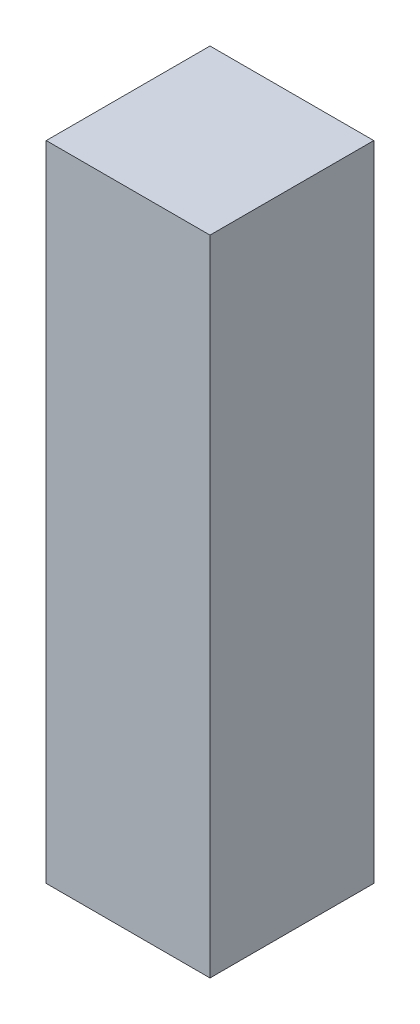
ISO-10303-21;
HEADER;
FILE_DESCRIPTION(('STEP AP214'),'2;1');
FILE_NAME('part.step','',(''),(''),'','','');
FILE_SCHEMA(('AUTOMOTIVE_DESIGN { 1 0 10303 214 1 1 1 1 }'));
ENDSEC;
DATA;
#1=APPLICATION_CONTEXT('core data for automotive mechanical design processes');
#2=APPLICATION_PROTOCOL_DEFINITION('international standard','automotive_design',2000,#1);
#3=PRODUCT_CONTEXT('',#1,'mechanical');
#4=PRODUCT('Part','Part','',(#3));
#5=PRODUCT_RELATED_PRODUCT_CATEGORY('part','',(#4));
#6=PRODUCT_DEFINITION_FORMATION('','',#4);
#7=PRODUCT_DEFINITION_CONTEXT('part definition',#1,'design');
#8=PRODUCT_DEFINITION('design','',#6,#7);
#9=PRODUCT_DEFINITION_SHAPE('','',#8);
#10=(LENGTH_UNIT() NAMED_UNIT(*) SI_UNIT(.MILLI.,.METRE.));
#11=(NAMED_UNIT(*) PLANE_ANGLE_UNIT() SI_UNIT($,.RADIAN.));
#12=(NAMED_UNIT(*) SI_UNIT($,.STERADIAN.) SOLID_ANGLE_UNIT());
#13=UNCERTAINTY_MEASURE_WITH_UNIT(LENGTH_MEASURE(1.E-05),#10,'distance_accuracy_value','');
#14=(GEOMETRIC_REPRESENTATION_CONTEXT(3) GLOBAL_UNCERTAINTY_ASSIGNED_CONTEXT((#13)) GLOBAL_UNIT_ASSIGNED_CONTEXT((#10,
#11,#12)) REPRESENTATION_CONTEXT('',''));
#15=CARTESIAN_POINT('',(0.,0.,0.));
#16=DIRECTION('',(0.,0.,1.));
#17=DIRECTION('',(1.,0.,0.));
#18=AXIS2_PLACEMENT_3D('',#15,#16,#17);
#19=CARTESIAN_POINT('',(3.5,13.75,3.5));
#20=DIRECTION('',(-1.,0.,0.));
#21=DIRECTION('',(0.,0.,1.));
#22=AXIS2_PLACEMENT_3D('',#19,#20,#21);
#23=PLANE('',#22);
#24=DIRECTION('',(0.,0.,-1.));
#25=VECTOR('',#24,1.);
#26=CARTESIAN_POINT('',(3.5,-13.75,3.5));
#27=LINE('',#26,#25);
#28=CARTESIAN_POINT('',(3.5,-13.75,3.5));
#29=VERTEX_POINT('',#28);
#30=CARTESIAN_POINT('',(3.5,-13.75,-3.5));
#31=VERTEX_POINT('',#30);
#32=EDGE_CURVE('E98',#29,#31,#27,.T.);
#33=ORIENTED_EDGE('',*,*,#32,.T.);
#34=DIRECTION('',(0.,-1.,0.));
#35=VECTOR('',#34,1.);
#36=CARTESIAN_POINT('',(3.5,13.75,-3.5));
#37=LINE('',#36,#35);
#38=CARTESIAN_POINT('',(3.5,13.75,-3.5));
#39=VERTEX_POINT('',#38);
#40=EDGE_CURVE('E11',#39,#31,#37,.T.);
#41=ORIENTED_EDGE('',*,*,#40,.F.);
#42=DIRECTION('',(0.,0.,-1.));
#43=VECTOR('',#42,1.);
#44=CARTESIAN_POINT('',(3.5,13.75,3.5));
#45=LINE('',#44,#43);
#46=CARTESIAN_POINT('',(3.5,13.75,3.5));
#47=VERTEX_POINT('',#46);
#48=EDGE_CURVE('E86',#47,#39,#45,.T.);
#49=ORIENTED_EDGE('',*,*,#48,.F.);
#50=DIRECTION('',(0.,-1.,0.));
#51=VECTOR('',#50,1.);
#52=CARTESIAN_POINT('',(3.5,13.75,3.5));
#53=LINE('',#52,#51);
#54=EDGE_CURVE('E94',#47,#29,#53,.T.);
#55=ORIENTED_EDGE('',*,*,#54,.T.);
#56=EDGE_LOOP('',(#33,#41,#49,#55));
#57=FACE_BOUND('',#56,.T.);
#58=ADVANCED_FACE('F35',(#57),#23,.F.);
#59=CARTESIAN_POINT('',(-3.5,13.75,-3.5));
#60=DIRECTION('',(0.,0.,1.));
#61=DIRECTION('',(1.,0.,0.));
#62=AXIS2_PLACEMENT_3D('',#59,#60,#61);
#63=PLANE('',#62);
#64=DIRECTION('',(-1.,0.,0.));
#65=VECTOR('',#64,1.);
#66=CARTESIAN_POINT('',(-3.5,-13.75,-3.5));
#67=LINE('',#66,#65);
#68=CARTESIAN_POINT('',(-3.5,-13.75,-3.5));
#69=VERTEX_POINT('',#68);
#70=EDGE_CURVE('E90',#31,#69,#67,.T.);
#71=ORIENTED_EDGE('',*,*,#70,.T.);
#72=DIRECTION('',(0.,-1.,0.));
#73=VECTOR('',#72,1.);
#74=CARTESIAN_POINT('',(-3.5,13.75,-3.5));
#75=LINE('',#74,#73);
#76=CARTESIAN_POINT('',(-3.5,13.75,-3.5));
#77=VERTEX_POINT('',#76);
#78=EDGE_CURVE('E43',#77,#69,#75,.T.);
#79=ORIENTED_EDGE('',*,*,#78,.F.);
#80=DIRECTION('',(-1.,0.,0.));
#81=VECTOR('',#80,1.);
#82=CARTESIAN_POINT('',(-3.5,13.75,-3.5));
#83=LINE('',#82,#81);
#84=EDGE_CURVE('E81',#39,#77,#83,.T.);
#85=ORIENTED_EDGE('',*,*,#84,.F.);
#86=ORIENTED_EDGE('',*,*,#40,.T.);
#87=EDGE_LOOP('',(#71,#79,#85,#86));
#88=FACE_BOUND('',#87,.T.);
#89=ADVANCED_FACE('F89',(#88),#63,.F.);
#90=CARTESIAN_POINT('',(-3.5,13.75,3.5));
#91=DIRECTION('',(1.,0.,0.));
#92=DIRECTION('',(0.,0.,-1.));
#93=AXIS2_PLACEMENT_3D('',#90,#91,#92);
#94=PLANE('',#93);
#95=DIRECTION('',(0.,0.,1.));
#96=VECTOR('',#95,1.);
#97=CARTESIAN_POINT('',(-3.5,-13.75,3.5));
#98=LINE('',#97,#96);
#99=CARTESIAN_POINT('',(-3.5,-13.75,3.5));
#100=VERTEX_POINT('',#99);
#101=EDGE_CURVE('E68',#69,#100,#98,.T.);
#102=ORIENTED_EDGE('',*,*,#101,.T.);
#103=DIRECTION('',(0.,-1.,0.));
#104=VECTOR('',#103,1.);
#105=CARTESIAN_POINT('',(-3.5,13.75,3.5));
#106=LINE('',#105,#104);
#107=CARTESIAN_POINT('',(-3.5,13.75,3.5));
#108=VERTEX_POINT('',#107);
#109=EDGE_CURVE('E91',#108,#100,#106,.T.);
#110=ORIENTED_EDGE('',*,*,#109,.F.);
#111=DIRECTION('',(0.,0.,1.));
#112=VECTOR('',#111,1.);
#113=CARTESIAN_POINT('',(-3.5,13.75,3.5));
#114=LINE('',#113,#112);
#115=EDGE_CURVE('E84',#77,#108,#114,.T.);
#116=ORIENTED_EDGE('',*,*,#115,.F.);
#117=ORIENTED_EDGE('',*,*,#78,.T.);
#118=EDGE_LOOP('',(#102,#110,#116,#117));
#119=FACE_BOUND('',#118,.T.);
#120=ADVANCED_FACE('F92',(#119),#94,.F.);
#121=CARTESIAN_POINT('',(-3.5,13.75,3.5));
#122=DIRECTION('',(0.,0.,-1.));
#123=DIRECTION('',(-1.,0.,0.));
#124=AXIS2_PLACEMENT_3D('',#121,#122,#123);
#125=PLANE('',#124);
#126=DIRECTION('',(1.,0.,0.));
#127=VECTOR('',#126,1.);
#128=CARTESIAN_POINT('',(-3.5,-13.75,3.5));
#129=LINE('',#128,#127);
#130=EDGE_CURVE('E74',#100,#29,#129,.T.);
#131=ORIENTED_EDGE('',*,*,#130,.T.);
#132=ORIENTED_EDGE('',*,*,#54,.F.);
#133=DIRECTION('',(1.,0.,0.));
#134=VECTOR('',#133,1.);
#135=CARTESIAN_POINT('',(-3.5,13.75,3.5));
#136=LINE('',#135,#134);
#137=EDGE_CURVE('E51',#108,#47,#136,.T.);
#138=ORIENTED_EDGE('',*,*,#137,.F.);
#139=ORIENTED_EDGE('',*,*,#109,.T.);
#140=EDGE_LOOP('',(#131,#132,#138,#139));
#141=FACE_BOUND('',#140,.T.);
#142=ADVANCED_FACE('F105',(#141),#125,.F.);
#143=CARTESIAN_POINT('',(0.,13.75,0.));
#144=DIRECTION('',(0.,-1.,0.));
#145=DIRECTION('',(0.,0.,-1.));
#146=AXIS2_PLACEMENT_3D('',#143,#144,#145);
#147=PLANE('',#146);
#148=ORIENTED_EDGE('',*,*,#48,.T.);
#149=ORIENTED_EDGE('',*,*,#84,.T.);
#150=ORIENTED_EDGE('',*,*,#115,.T.);
#151=ORIENTED_EDGE('',*,*,#137,.T.);
#152=EDGE_LOOP('',(#148,#149,#150,#151));
#153=FACE_BOUND('',#152,.T.);
#154=ADVANCED_FACE('F82',(#153),#147,.F.);
#155=CARTESIAN_POINT('',(0.,-13.75,0.));
#156=DIRECTION('',(0.,-1.,0.));
#157=DIRECTION('',(0.,0.,-1.));
#158=AXIS2_PLACEMENT_3D('',#155,#156,#157);
#159=PLANE('',#158);
#160=ORIENTED_EDGE('',*,*,#32,.F.);
#161=ORIENTED_EDGE('',*,*,#130,.F.);
#162=ORIENTED_EDGE('',*,*,#101,.F.);
#163=ORIENTED_EDGE('',*,*,#70,.F.);
#164=EDGE_LOOP('',(#160,#161,#162,#163));
#165=FACE_BOUND('',#164,.T.);
#166=ADVANCED_FACE('F108',(#165),#159,.T.);
#167=CLOSED_SHELL('',(#58,#89,#120,#142,#154,#166));
#168=MANIFOLD_SOLID_BREP('B2',#167);
#169=ADVANCED_BREP_SHAPE_REPRESENTATION('',(#18,#168),#14);
#170=SHAPE_DEFINITION_REPRESENTATION(#9,#169);
ENDSEC;
END-ISO-10303-21;
